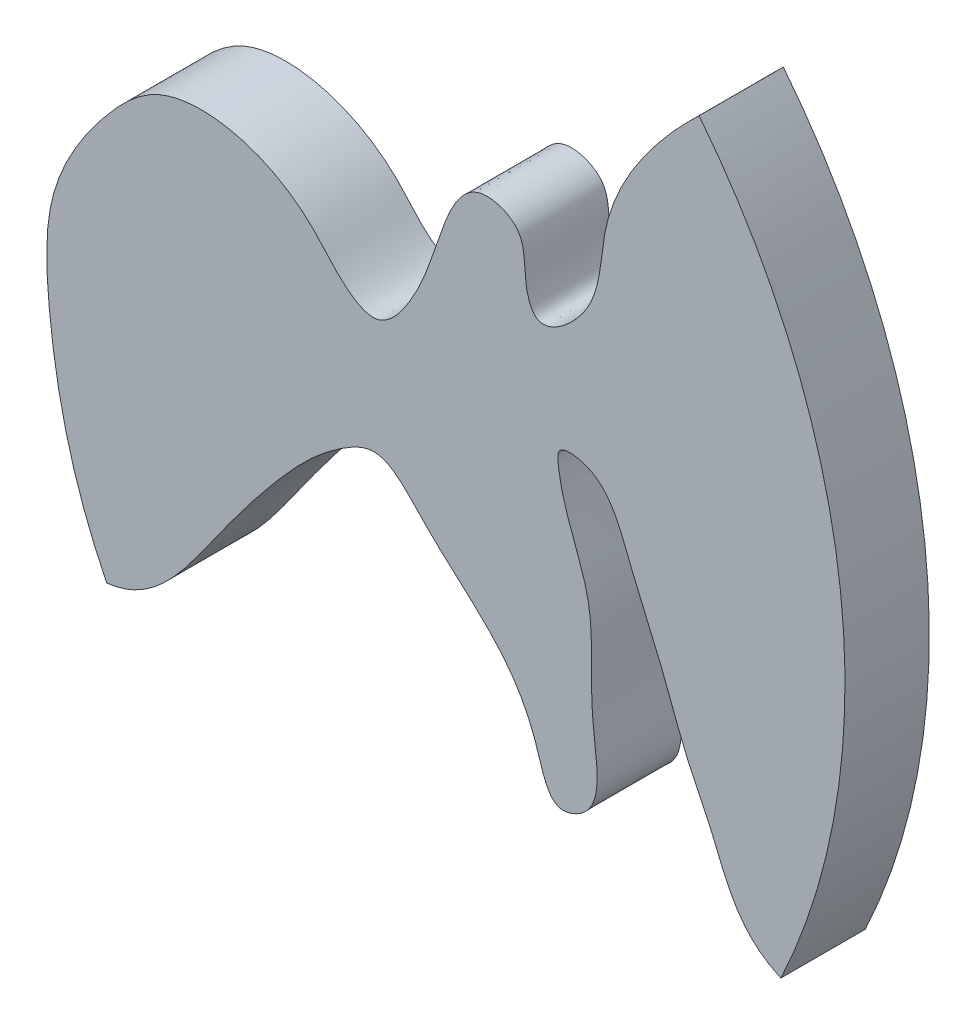
ISO-10303-21;
HEADER;
FILE_DESCRIPTION(('STEP AP214'),'2;1');
FILE_NAME('part.step','',(''),(''),'','','');
FILE_SCHEMA(('AUTOMOTIVE_DESIGN { 1 0 10303 214 1 1 1 1 }'));
ENDSEC;
DATA;
#1=APPLICATION_CONTEXT('core data for automotive mechanical design processes');
#2=APPLICATION_PROTOCOL_DEFINITION('international standard','automotive_design',2000,#1);
#3=PRODUCT_CONTEXT('',#1,'mechanical');
#4=PRODUCT('Part','Part','',(#3));
#5=PRODUCT_RELATED_PRODUCT_CATEGORY('part','',(#4));
#6=PRODUCT_DEFINITION_FORMATION('','',#4);
#7=PRODUCT_DEFINITION_CONTEXT('part definition',#1,'design');
#8=PRODUCT_DEFINITION('design','',#6,#7);
#9=PRODUCT_DEFINITION_SHAPE('','',#8);
#10=(LENGTH_UNIT() NAMED_UNIT(*) SI_UNIT(.MILLI.,.METRE.));
#11=(NAMED_UNIT(*) PLANE_ANGLE_UNIT() SI_UNIT($,.RADIAN.));
#12=(NAMED_UNIT(*) SI_UNIT($,.STERADIAN.) SOLID_ANGLE_UNIT());
#13=UNCERTAINTY_MEASURE_WITH_UNIT(LENGTH_MEASURE(1.E-05),#10,'distance_accuracy_value','');
#14=(GEOMETRIC_REPRESENTATION_CONTEXT(3) GLOBAL_UNCERTAINTY_ASSIGNED_CONTEXT((#13)) GLOBAL_UNIT_ASSIGNED_CONTEXT((#10,
#11,#12)) REPRESENTATION_CONTEXT('',''));
#15=CARTESIAN_POINT('',(0.,0.,0.));
#16=DIRECTION('',(0.,0.,1.));
#17=DIRECTION('',(1.,0.,0.));
#18=AXIS2_PLACEMENT_3D('',#15,#16,#17);
#19=CARTESIAN_POINT('',(15.5302636255831,10.8282867655375,1.5875));
#20=CARTESIAN_POINT('',(14.8939400814353,12.095087950839,1.5875));
#21=CARTESIAN_POINT('',(14.4388683424754,13.9812628329786,1.5875));
#22=CARTESIAN_POINT('',(14.3435376753048,16.7342572903243,1.5875));
#23=CARTESIAN_POINT('',(15.2690820113943,18.2447230478923,1.5875));
#24=CARTESIAN_POINT('',(16.5062417067426,19.5074156895581,1.5875));
#25=CARTESIAN_POINT('',(18.1400341357042,19.4662167540936,1.5875));
#26=CARTESIAN_POINT('',(19.3320027450902,18.7361806333531,1.5875));
#27=CARTESIAN_POINT('',(19.9024481651618,17.9654679208199,1.5875));
#28=CARTESIAN_POINT('',(20.6817431216853,17.4715706074241,1.5875));
#29=CARTESIAN_POINT('',(21.448331705191,18.5090316874532,1.5875));
#30=CARTESIAN_POINT('',(21.7333698693151,19.5035376140276,1.5875));
#31=CARTESIAN_POINT('',(22.2913050843866,20.9390720189672,1.5875));
#32=CARTESIAN_POINT('',(23.5141092084125,20.4968895674322,1.5875));
#33=CARTESIAN_POINT('',(23.3329728338759,19.7355430144696,1.5875));
#34=CARTESIAN_POINT('',(23.67873827835,18.9513492838782,1.5875));
#35=CARTESIAN_POINT('',(24.8928291355082,19.8566339972601,1.5875));
#36=CARTESIAN_POINT('',(24.7040697825867,21.7985625785221,1.5875));
#37=CARTESIAN_POINT('',(25.9370407985922,23.3157792325648,1.5875));
#38=CARTESIAN_POINT('',(26.6865750307459,24.0301124446115,1.5875));
#39=B_SPLINE_CURVE_WITH_KNOTS('',3,(#19,#20,#21,#22,#23,#24,#25,#26,#27,#28,#29,#30,#31,#32,#33,
#34,#35,#36,#37,#38),.UNSPECIFIED.,.F.,.F.,(4,1,1,1,1,1,1,1,1,1,1,1,1,1,1,1,1,4),(0.,
0.163826767800243,0.228294741353153,0.314759461357509,0.363733254666579,0.427293953650554,
0.487534151582899,0.520272146887113,0.543412506941602,0.580045632622776,0.637017642997619,
0.689480467875241,0.715613553959925,0.754599817932839,0.768000955969037,0.802503201173287,
0.870835865524209,1.),.UNSPECIFIED.);
#40=DIRECTION('',(0.,0.,-1.));
#41=VECTOR('',#40,1.);
#42=SURFACE_OF_LINEAR_EXTRUSION('',#39,#41);
#43=CARTESIAN_POINT('',(15.5302636255831,10.8282867655375,0.));
#44=CARTESIAN_POINT('',(14.8939400814353,12.095087950839,0.));
#45=CARTESIAN_POINT('',(14.4388683424754,13.9812628329786,0.));
#46=CARTESIAN_POINT('',(14.3435376753048,16.7342572903243,0.));
#47=CARTESIAN_POINT('',(15.2690820113943,18.2447230478923,0.));
#48=CARTESIAN_POINT('',(16.5062417067426,19.5074156895581,0.));
#49=CARTESIAN_POINT('',(18.1400341357042,19.4662167540936,0.));
#50=CARTESIAN_POINT('',(19.3320027450902,18.7361806333531,0.));
#51=CARTESIAN_POINT('',(19.9024481651618,17.9654679208199,0.));
#52=CARTESIAN_POINT('',(20.6817431216853,17.4715706074241,0.));
#53=CARTESIAN_POINT('',(21.448331705191,18.5090316874532,0.));
#54=CARTESIAN_POINT('',(21.7333698693151,19.5035376140276,0.));
#55=CARTESIAN_POINT('',(22.2913050843866,20.9390720189672,0.));
#56=CARTESIAN_POINT('',(23.5141092084125,20.4968895674322,0.));
#57=CARTESIAN_POINT('',(23.3329728338759,19.7355430144696,0.));
#58=CARTESIAN_POINT('',(23.67873827835,18.9513492838782,0.));
#59=CARTESIAN_POINT('',(24.8928291355082,19.8566339972601,0.));
#60=CARTESIAN_POINT('',(24.7040697825867,21.7985625785221,0.));
#61=CARTESIAN_POINT('',(25.9370407985922,23.3157792325648,0.));
#62=CARTESIAN_POINT('',(26.6865750307459,24.0301124446115,0.));
#63=B_SPLINE_CURVE_WITH_KNOTS('',3,(#43,#44,#45,#46,#47,#48,#49,#50,#51,#52,#53,#54,#55,#56,#57,
#58,#59,#60,#61,#62),.UNSPECIFIED.,.F.,.F.,(4,1,1,1,1,1,1,1,1,1,1,1,1,1,1,1,1,4),(0.,
0.163826767800243,0.228294741353153,0.314759461357509,0.363733254666579,0.427293953650554,
0.487534151582899,0.520272146887113,0.543412506941602,0.580045632622776,0.637017642997619,
0.689480467875241,0.715613553959925,0.754599817932839,0.768000955969037,0.802503201173287,
0.870835865524209,1.),.UNSPECIFIED.);
#64=CARTESIAN_POINT('',(15.530263623224,10.8282867652558,0.));
#65=VERTEX_POINT('',#64);
#66=CARTESIAN_POINT('',(26.6865750307459,24.0301124446115,0.));
#67=VERTEX_POINT('',#66);
#68=EDGE_CURVE('E79',#65,#67,#63,.T.);
#69=ORIENTED_EDGE('',*,*,#68,.F.);
#70=DIRECTION('',(0.,0.,-1.));
#71=VECTOR('',#70,1.);
#72=CARTESIAN_POINT('',(15.530263623224,10.8282867652558,1.5875));
#73=LINE('',#72,#71);
#74=CARTESIAN_POINT('',(15.530263623224,10.8282867652558,1.5875));
#75=VERTEX_POINT('',#74);
#76=EDGE_CURVE('E11',#75,#65,#73,.T.);
#77=ORIENTED_EDGE('',*,*,#76,.F.);
#78=CARTESIAN_POINT('',(26.6865750307459,24.0301124446115,1.5875));
#79=VERTEX_POINT('',#78);
#80=EDGE_CURVE('E77',#75,#79,#39,.T.);
#81=ORIENTED_EDGE('',*,*,#80,.T.);
#82=DIRECTION('',(0.,0.,-1.));
#83=VECTOR('',#82,1.);
#84=CARTESIAN_POINT('',(26.6865750307459,24.0301124446115,1.5875));
#85=LINE('',#84,#83);
#86=EDGE_CURVE('E73',#79,#67,#85,.T.);
#87=ORIENTED_EDGE('',*,*,#86,.T.);
#88=EDGE_LOOP('',(#69,#77,#81,#87));
#89=FACE_BOUND('',#88,.T.);
#90=ADVANCED_FACE('F38',(#89),#42,.T.);
#91=CARTESIAN_POINT('',(5.24217409868645,10.7359674679487,1.5875));
#92=CARTESIAN_POINT('',(6.71809569007158,10.5583363116698,1.5875));
#93=CARTESIAN_POINT('',(7.9181175137713,12.0334760895931,1.5875));
#94=CARTESIAN_POINT('',(10.468854721958,12.7659447435013,1.5875));
#95=CARTESIAN_POINT('',(12.4429037284296,12.0981408705217,1.5875));
#96=CARTESIAN_POINT('',(14.0399826679159,10.9310546034412,1.5875));
#97=CARTESIAN_POINT('',(16.2263714118939,10.6185513462935,1.5875));
#98=CARTESIAN_POINT('',(17.4991508982318,12.5178776573258,1.5875));
#99=CARTESIAN_POINT('',(18.6877190372775,14.1014583521492,1.5875));
#100=CARTESIAN_POINT('',(19.6579399153575,15.1072457767917,1.5875));
#101=CARTESIAN_POINT('',(20.7365942091424,15.6711403370614,1.5875));
#102=CARTESIAN_POINT('',(21.5924143850138,14.6574307728109,1.5875));
#103=CARTESIAN_POINT('',(22.7185605146398,13.7475085461238,1.5875));
#104=CARTESIAN_POINT('',(23.5698295134374,12.7032800384112,1.5875));
#105=CARTESIAN_POINT('',(23.8625939485116,11.2745807664498,1.5875));
#106=CARTESIAN_POINT('',(24.9533623804991,11.6978195279501,1.5875));
#107=CARTESIAN_POINT('',(24.5406586001507,13.3497868624274,1.5875));
#108=CARTESIAN_POINT('',(24.8082580394684,15.1397570692778,1.5875));
#109=CARTESIAN_POINT('',(24.0950168556002,16.3011618970305,1.5875));
#110=CARTESIAN_POINT('',(23.998924349624,17.331566415853,1.5875));
#111=CARTESIAN_POINT('',(24.9340287374693,17.3133291685319,1.5875));
#112=CARTESIAN_POINT('',(25.3682131220015,16.0394970111106,1.5875));
#113=CARTESIAN_POINT('',(25.9914607242334,14.7264604105497,1.5875));
#114=CARTESIAN_POINT('',(26.4067642072258,13.484600274914,1.5875));
#115=CARTESIAN_POINT('',(27.1285210517247,12.1460637718713,1.5875));
#116=CARTESIAN_POINT('',(27.3699983663482,11.1039666920429,1.5875));
#117=CARTESIAN_POINT('',(28.2284558404309,10.7359674679487,1.5875));
#118=B_SPLINE_CURVE_WITH_KNOTS('',3,(#91,#92,#93,#94,#95,#96,#97,#98,#99,#100,#101,#102,#103,
#104,#105,#106,#107,#108,#109,#110,#111,#112,#113,#114,#115,#116,#117),.UNSPECIFIED.,.F.,.F.,(4,
1,1,1,1,1,1,1,1,1,1,1,1,1,1,1,1,1,1,1,1,1,1,1,4),(0.,0.103449194536741,0.139241600743804,
0.205578261756407,0.258601603271188,0.299465828186436,0.363653171051923,0.418235104391856,
0.461509401392811,0.476757705922729,0.506042885966889,0.548409229610876,0.597041834513843,
0.622241462987159,0.632003189668546,0.675047866330173,0.726967039234851,0.779124265533172,
0.786558575085862,0.795901317613981,0.835776716059717,0.878715552765477,0.917236667041862,
0.938498415893101,1.),.UNSPECIFIED.);
#119=DIRECTION('',(0.,0.,-1.));
#120=VECTOR('',#119,1.);
#121=SURFACE_OF_LINEAR_EXTRUSION('',#118,#120);
#122=CARTESIAN_POINT('',(5.24217409868645,10.7359674679487,0.));
#123=CARTESIAN_POINT('',(6.71809569007158,10.5583363116698,0.));
#124=CARTESIAN_POINT('',(7.9181175137713,12.0334760895931,0.));
#125=CARTESIAN_POINT('',(10.468854721958,12.7659447435013,0.));
#126=CARTESIAN_POINT('',(12.4429037284296,12.0981408705217,0.));
#127=CARTESIAN_POINT('',(14.0399826679159,10.9310546034412,0.));
#128=CARTESIAN_POINT('',(16.2263714118939,10.6185513462935,0.));
#129=CARTESIAN_POINT('',(17.4991508982318,12.5178776573258,0.));
#130=CARTESIAN_POINT('',(18.6877190372775,14.1014583521492,0.));
#131=CARTESIAN_POINT('',(19.6579399153575,15.1072457767917,0.));
#132=CARTESIAN_POINT('',(20.7365942091424,15.6711403370614,0.));
#133=CARTESIAN_POINT('',(21.5924143850138,14.6574307728109,0.));
#134=CARTESIAN_POINT('',(22.7185605146398,13.7475085461238,0.));
#135=CARTESIAN_POINT('',(23.5698295134374,12.7032800384112,0.));
#136=CARTESIAN_POINT('',(23.8625939485116,11.2745807664498,0.));
#137=CARTESIAN_POINT('',(24.9533623804991,11.6978195279501,0.));
#138=CARTESIAN_POINT('',(24.5406586001507,13.3497868624274,0.));
#139=CARTESIAN_POINT('',(24.8082580394684,15.1397570692778,0.));
#140=CARTESIAN_POINT('',(24.0950168556002,16.3011618970305,0.));
#141=CARTESIAN_POINT('',(23.998924349624,17.331566415853,0.));
#142=CARTESIAN_POINT('',(24.9340287374693,17.3133291685319,0.));
#143=CARTESIAN_POINT('',(25.3682131220015,16.0394970111106,0.));
#144=CARTESIAN_POINT('',(25.9914607242334,14.7264604105497,0.));
#145=CARTESIAN_POINT('',(26.4067642072258,13.484600274914,0.));
#146=CARTESIAN_POINT('',(27.1285210517247,12.1460637718713,0.));
#147=CARTESIAN_POINT('',(27.3699983663482,11.1039666920429,0.));
#148=CARTESIAN_POINT('',(28.2284558404309,10.7359674679487,0.));
#149=B_SPLINE_CURVE_WITH_KNOTS('',3,(#122,#123,#124,#125,#126,#127,#128,#129,#130,#131,#132,
#133,#134,#135,#136,#137,#138,#139,#140,#141,#142,#143,#144,#145,#146,#147,#148),.UNSPECIFIED.,
.F.,.F.,(4,1,1,1,1,1,1,1,1,1,1,1,1,1,1,1,1,1,1,1,1,1,1,1,4),(0.,0.103449194536741,
0.139241600743804,0.205578261756407,0.258601603271188,0.299465828186436,0.363653171051923,
0.418235104391856,0.461509401392811,0.476757705922729,0.506042885966889,0.548409229610876,
0.597041834513843,0.622241462987159,0.632003189668546,0.675047866330173,0.726967039234851,
0.779124265533172,0.786558575085862,0.795901317613981,0.835776716059717,0.878715552765477,
0.917236667041862,0.938498415893101,1.),.UNSPECIFIED.);
#150=CARTESIAN_POINT('',(28.2284558404309,10.7359674679487,0.));
#151=VERTEX_POINT('',#150);
#152=EDGE_CURVE('E67',#65,#151,#149,.T.);
#153=ORIENTED_EDGE('',*,*,#152,.T.);
#154=DIRECTION('',(0.,0.,-1.));
#155=VECTOR('',#154,1.);
#156=CARTESIAN_POINT('',(28.2284558404309,10.7359674679487,1.5875));
#157=LINE('',#156,#155);
#158=CARTESIAN_POINT('',(28.2284558404309,10.7359674679487,1.5875));
#159=VERTEX_POINT('',#158);
#160=EDGE_CURVE('E47',#159,#151,#157,.T.);
#161=ORIENTED_EDGE('',*,*,#160,.F.);
#162=EDGE_CURVE('E80',#75,#159,#118,.T.);
#163=ORIENTED_EDGE('',*,*,#162,.F.);
#164=ORIENTED_EDGE('',*,*,#76,.T.);
#165=EDGE_LOOP('',(#153,#161,#163,#164));
#166=FACE_BOUND('',#165,.T.);
#167=ADVANCED_FACE('F81',(#166),#121,.F.);
#168=CARTESIAN_POINT('',(16.7353149695587,16.1394582768876,1.5875));
#169=DIRECTION('',(0.,0.,-1.));
#170=DIRECTION('',(-1.,0.,0.));
#171=AXIS2_PLACEMENT_3D('',#168,#169,#170);
#172=CYLINDRICAL_SURFACE('',#171,12.7);
#173=CARTESIAN_POINT('',(16.7353149695587,16.1394582768876,0.));
#174=DIRECTION('',(0.,0.,1.));
#175=DIRECTION('',(1.,0.,0.));
#176=AXIS2_PLACEMENT_3D('',#173,#174,#175);
#177=CIRCLE('',#176,12.7);
#178=EDGE_CURVE('E84',#151,#67,#177,.T.);
#179=ORIENTED_EDGE('',*,*,#178,.T.);
#180=ORIENTED_EDGE('',*,*,#86,.F.);
#181=CARTESIAN_POINT('',(16.7353149695587,16.1394582768876,1.5875));
#182=DIRECTION('',(0.,0.,1.));
#183=DIRECTION('',(1.,0.,0.));
#184=AXIS2_PLACEMENT_3D('',#181,#182,#183);
#185=CIRCLE('',#184,12.7);
#186=EDGE_CURVE('E55',#159,#79,#185,.T.);
#187=ORIENTED_EDGE('',*,*,#186,.F.);
#188=ORIENTED_EDGE('',*,*,#160,.T.);
#189=EDGE_LOOP('',(#179,#180,#187,#188));
#190=FACE_BOUND('',#189,.T.);
#191=ADVANCED_FACE('F102',(#190),#172,.T.);
#192=CARTESIAN_POINT('',(0.,0.,1.5875));
#193=DIRECTION('',(0.,0.,1.));
#194=DIRECTION('',(1.,0.,0.));
#195=AXIS2_PLACEMENT_3D('',#192,#193,#194);
#196=PLANE('',#195);
#197=ORIENTED_EDGE('',*,*,#80,.F.);
#198=ORIENTED_EDGE('',*,*,#162,.T.);
#199=ORIENTED_EDGE('',*,*,#186,.T.);
#200=EDGE_LOOP('',(#197,#198,#199));
#201=FACE_BOUND('',#200,.T.);
#202=ADVANCED_FACE('F83',(#201),#196,.T.);
#203=CARTESIAN_POINT('',(0.,0.,0.));
#204=DIRECTION('',(0.,0.,1.));
#205=DIRECTION('',(1.,0.,0.));
#206=AXIS2_PLACEMENT_3D('',#203,#204,#205);
#207=PLANE('',#206);
#208=ORIENTED_EDGE('',*,*,#68,.T.);
#209=ORIENTED_EDGE('',*,*,#178,.F.);
#210=ORIENTED_EDGE('',*,*,#152,.F.);
#211=EDGE_LOOP('',(#208,#209,#210));
#212=FACE_BOUND('',#211,.T.);
#213=ADVANCED_FACE('F106',(#212),#207,.F.);
#214=CLOSED_SHELL('',(#90,#167,#191,#202,#213));
#215=MANIFOLD_SOLID_BREP('B2',#214);
#216=ADVANCED_BREP_SHAPE_REPRESENTATION('',(#18,#215),#14);
#217=SHAPE_DEFINITION_REPRESENTATION(#9,#216);
ENDSEC;
END-ISO-10303-21;
